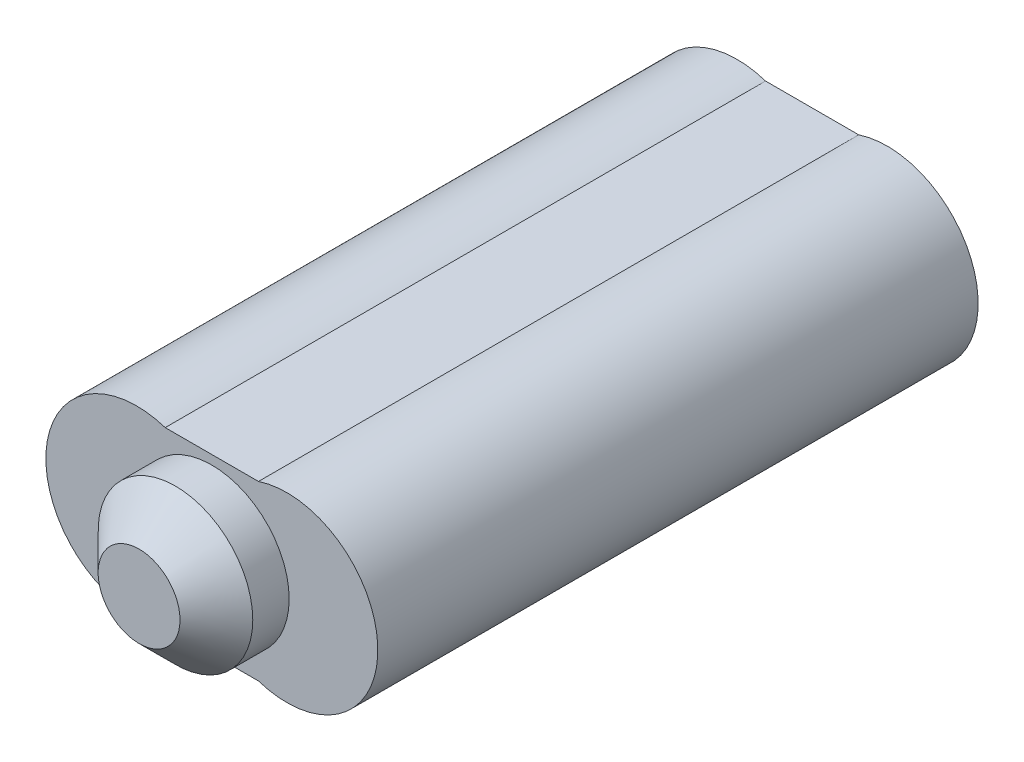
ISO-10303-21;
HEADER;
FILE_DESCRIPTION(('STEP AP214'),'2;1');
FILE_NAME('part.step','',(''),(''),'','','');
FILE_SCHEMA(('AUTOMOTIVE_DESIGN { 1 0 10303 214 1 1 1 1 }'));
ENDSEC;
DATA;
#1=APPLICATION_CONTEXT('core data for automotive mechanical design processes');
#2=APPLICATION_PROTOCOL_DEFINITION('international standard','automotive_design',2000,#1);
#3=PRODUCT_CONTEXT('',#1,'mechanical');
#4=PRODUCT('Part','Part','',(#3));
#5=PRODUCT_RELATED_PRODUCT_CATEGORY('part','',(#4));
#6=PRODUCT_DEFINITION_FORMATION('','',#4);
#7=PRODUCT_DEFINITION_CONTEXT('part definition',#1,'design');
#8=PRODUCT_DEFINITION('design','',#6,#7);
#9=PRODUCT_DEFINITION_SHAPE('','',#8);
#10=(LENGTH_UNIT() NAMED_UNIT(*) SI_UNIT(.MILLI.,.METRE.));
#11=(NAMED_UNIT(*) PLANE_ANGLE_UNIT() SI_UNIT($,.RADIAN.));
#12=(NAMED_UNIT(*) SI_UNIT($,.STERADIAN.) SOLID_ANGLE_UNIT());
#13=UNCERTAINTY_MEASURE_WITH_UNIT(LENGTH_MEASURE(1.E-05),#10,'distance_accuracy_value','');
#14=(GEOMETRIC_REPRESENTATION_CONTEXT(3) GLOBAL_UNCERTAINTY_ASSIGNED_CONTEXT((#13)) GLOBAL_UNIT_ASSIGNED_CONTEXT((#10,
#11,#12)) REPRESENTATION_CONTEXT('',''));
#15=CARTESIAN_POINT('',(0.,0.,0.));
#16=DIRECTION('',(0.,0.,1.));
#17=DIRECTION('',(1.,0.,0.));
#18=AXIS2_PLACEMENT_3D('',#15,#16,#17);
#19=CARTESIAN_POINT('',(0.,0.,66.));
#20=DIRECTION('',(0.,0.,-1.));
#21=DIRECTION('',(-1.,0.,0.));
#22=AXIS2_PLACEMENT_3D('',#19,#20,#21);
#23=CYLINDRICAL_SURFACE('',#22,10.);
#24=CARTESIAN_POINT('',(0.,0.,0.));
#25=DIRECTION('',(0.,0.,1.));
#26=DIRECTION('',(1.,0.,0.));
#27=AXIS2_PLACEMENT_3D('',#24,#25,#26);
#28=CIRCLE('',#27,10.);
#29=CARTESIAN_POINT('',(3.12249899919921,9.5,0.));
#30=VERTEX_POINT('',#29);
#31=CARTESIAN_POINT('',(3.12249899919921,-9.5,0.));
#32=VERTEX_POINT('',#31);
#33=EDGE_CURVE('E117',#30,#32,#28,.T.);
#34=ORIENTED_EDGE('',*,*,#33,.T.);
#35=DIRECTION('',(0.,0.,-1.));
#36=VECTOR('',#35,1.);
#37=CARTESIAN_POINT('',(3.12249899919921,-9.5,66.));
#38=LINE('',#37,#36);
#39=CARTESIAN_POINT('',(3.12249899919921,-9.5,66.));
#40=VERTEX_POINT('',#39);
#41=EDGE_CURVE('E106',#40,#32,#38,.T.);
#42=ORIENTED_EDGE('',*,*,#41,.F.);
#43=CARTESIAN_POINT('',(0.,0.,66.));
#44=DIRECTION('',(0.,0.,1.));
#45=DIRECTION('',(1.,0.,0.));
#46=AXIS2_PLACEMENT_3D('',#43,#44,#45);
#47=CIRCLE('',#46,10.);
#48=CARTESIAN_POINT('',(3.12249899919921,9.5,66.));
#49=VERTEX_POINT('',#48);
#50=EDGE_CURVE('E98',#49,#40,#47,.T.);
#51=ORIENTED_EDGE('',*,*,#50,.F.);
#52=DIRECTION('',(0.,0.,-1.));
#53=VECTOR('',#52,1.);
#54=CARTESIAN_POINT('',(3.12249899919921,9.5,66.));
#55=LINE('',#54,#53);
#56=EDGE_CURVE('E113',#49,#30,#55,.T.);
#57=ORIENTED_EDGE('',*,*,#56,.T.);
#58=EDGE_LOOP('',(#34,#42,#51,#57));
#59=FACE_BOUND('',#58,.T.);
#60=ADVANCED_FACE('F43',(#59),#23,.T.);
#61=CARTESIAN_POINT('',(3.12249899919921,-9.5,66.));
#62=DIRECTION('',(0.,1.,0.));
#63=DIRECTION('',(0.,0.,1.));
#64=AXIS2_PLACEMENT_3D('',#61,#62,#63);
#65=PLANE('',#64);
#66=DIRECTION('',(1.,0.,0.));
#67=VECTOR('',#66,1.);
#68=CARTESIAN_POINT('',(3.12249899919921,-9.5,0.));
#69=LINE('',#68,#67);
#70=CARTESIAN_POINT('',(13.3775010008008,-9.5,0.));
#71=VERTEX_POINT('',#70);
#72=EDGE_CURVE('E104',#32,#71,#69,.T.);
#73=ORIENTED_EDGE('',*,*,#72,.T.);
#74=DIRECTION('',(0.,0.,-1.));
#75=VECTOR('',#74,1.);
#76=CARTESIAN_POINT('',(13.3775010008008,-9.5,66.));
#77=LINE('',#76,#75);
#78=CARTESIAN_POINT('',(13.3775010008008,-9.5,66.));
#79=VERTEX_POINT('',#78);
#80=EDGE_CURVE('E102',#79,#71,#77,.T.);
#81=ORIENTED_EDGE('',*,*,#80,.F.);
#82=DIRECTION('',(1.,0.,0.));
#83=VECTOR('',#82,1.);
#84=CARTESIAN_POINT('',(3.12249899919921,-9.5,66.));
#85=LINE('',#84,#83);
#86=EDGE_CURVE('E93',#40,#79,#85,.T.);
#87=ORIENTED_EDGE('',*,*,#86,.F.);
#88=ORIENTED_EDGE('',*,*,#41,.T.);
#89=EDGE_LOOP('',(#73,#81,#87,#88));
#90=FACE_BOUND('',#89,.T.);
#91=ADVANCED_FACE('F103',(#90),#65,.F.);
#92=CARTESIAN_POINT('',(16.5,0.,66.));
#93=DIRECTION('',(0.,0.,-1.));
#94=DIRECTION('',(-1.,0.,0.));
#95=AXIS2_PLACEMENT_3D('',#92,#93,#94);
#96=CYLINDRICAL_SURFACE('',#95,10.);
#97=CARTESIAN_POINT('',(16.5,0.,0.));
#98=DIRECTION('',(0.,0.,1.));
#99=DIRECTION('',(1.,0.,0.));
#100=AXIS2_PLACEMENT_3D('',#97,#98,#99);
#101=CIRCLE('',#100,10.);
#102=CARTESIAN_POINT('',(13.3775010008008,9.5,0.));
#103=VERTEX_POINT('',#102);
#104=EDGE_CURVE('E79',#71,#103,#101,.T.);
#105=ORIENTED_EDGE('',*,*,#104,.T.);
#106=DIRECTION('',(0.,0.,-1.));
#107=VECTOR('',#106,1.);
#108=CARTESIAN_POINT('',(13.3775010008008,9.5,66.));
#109=LINE('',#108,#107);
#110=CARTESIAN_POINT('',(13.3775010008008,9.5,66.));
#111=VERTEX_POINT('',#110);
#112=EDGE_CURVE('E107',#111,#103,#109,.T.);
#113=ORIENTED_EDGE('',*,*,#112,.F.);
#114=CARTESIAN_POINT('',(16.5,0.,66.));
#115=DIRECTION('',(0.,0.,1.));
#116=DIRECTION('',(1.,0.,0.));
#117=AXIS2_PLACEMENT_3D('',#114,#115,#116);
#118=CIRCLE('',#117,10.);
#119=EDGE_CURVE('E96',#79,#111,#118,.T.);
#120=ORIENTED_EDGE('',*,*,#119,.F.);
#121=ORIENTED_EDGE('',*,*,#80,.T.);
#122=EDGE_LOOP('',(#105,#113,#120,#121));
#123=FACE_BOUND('',#122,.T.);
#124=ADVANCED_FACE('F109',(#123),#96,.T.);
#125=CARTESIAN_POINT('',(3.12249899919921,9.5,66.));
#126=DIRECTION('',(0.,-1.,0.));
#127=DIRECTION('',(0.,0.,-1.));
#128=AXIS2_PLACEMENT_3D('',#125,#126,#127);
#129=PLANE('',#128);
#130=DIRECTION('',(-1.,0.,0.));
#131=VECTOR('',#130,1.);
#132=CARTESIAN_POINT('',(3.12249899919921,9.5,0.));
#133=LINE('',#132,#131);
#134=EDGE_CURVE('E85',#103,#30,#133,.T.);
#135=ORIENTED_EDGE('',*,*,#134,.T.);
#136=ORIENTED_EDGE('',*,*,#56,.F.);
#137=DIRECTION('',(-1.,0.,0.));
#138=VECTOR('',#137,1.);
#139=CARTESIAN_POINT('',(3.12249899919921,9.5,66.));
#140=LINE('',#139,#138);
#141=EDGE_CURVE('E62',#111,#49,#140,.T.);
#142=ORIENTED_EDGE('',*,*,#141,.F.);
#143=ORIENTED_EDGE('',*,*,#112,.T.);
#144=EDGE_LOOP('',(#135,#136,#142,#143));
#145=FACE_BOUND('',#144,.T.);
#146=ADVANCED_FACE('F147',(#145),#129,.F.);
#147=CARTESIAN_POINT('',(0.,0.,66.));
#148=DIRECTION('',(0.,0.,1.));
#149=DIRECTION('',(1.,0.,0.));
#150=AXIS2_PLACEMENT_3D('',#147,#148,#149);
#151=PLANE('',#150);
#152=CARTESIAN_POINT('',(8.25,0.,66.));
#153=DIRECTION('',(0.,0.,1.));
#154=DIRECTION('',(1.,0.,0.));
#155=AXIS2_PLACEMENT_3D('',#152,#153,#154);
#156=CIRCLE('',#155,8.5);
#157=CARTESIAN_POINT('',(16.75,0.,66.));
#158=VERTEX_POINT('',#157);
#159=EDGE_CURVE('E132',#158,#158,#156,.T.);
#160=ORIENTED_EDGE('',*,*,#159,.F.);
#161=EDGE_LOOP('',(#160));
#162=FACE_BOUND('',#161,.T.);
#163=ORIENTED_EDGE('',*,*,#50,.T.);
#164=ORIENTED_EDGE('',*,*,#86,.T.);
#165=ORIENTED_EDGE('',*,*,#119,.T.);
#166=ORIENTED_EDGE('',*,*,#141,.T.);
#167=EDGE_LOOP('',(#163,#164,#165,#166));
#168=FACE_BOUND('',#167,.T.);
#169=ADVANCED_FACE('F94',(#162,#168),#151,.T.);
#170=CARTESIAN_POINT('',(0.,0.,0.));
#171=DIRECTION('',(0.,0.,1.));
#172=DIRECTION('',(1.,0.,0.));
#173=AXIS2_PLACEMENT_3D('',#170,#171,#172);
#174=PLANE('',#173);
#175=ORIENTED_EDGE('',*,*,#33,.F.);
#176=ORIENTED_EDGE('',*,*,#134,.F.);
#177=ORIENTED_EDGE('',*,*,#104,.F.);
#178=ORIENTED_EDGE('',*,*,#72,.F.);
#179=EDGE_LOOP('',(#175,#176,#177,#178));
#180=FACE_BOUND('',#179,.T.);
#181=ADVANCED_FACE('F146',(#180),#174,.F.);
#182=CARTESIAN_POINT('',(8.25,0.,74.));
#183=DIRECTION('',(0.,0.,-1.));
#184=DIRECTION('',(-1.,0.,0.));
#185=AXIS2_PLACEMENT_3D('',#182,#183,#184);
#186=CYLINDRICAL_SURFACE('',#185,8.5);
#187=CARTESIAN_POINT('',(8.25,0.,70.));
#188=DIRECTION('',(0.,0.,1.));
#189=DIRECTION('',(1.,0.,0.));
#190=AXIS2_PLACEMENT_3D('',#187,#188,#189);
#191=CIRCLE('',#190,8.5);
#192=CARTESIAN_POINT('',(16.75,0.,70.));
#193=VERTEX_POINT('',#192);
#194=EDGE_CURVE('E11',#193,#193,#191,.F.);
#195=ORIENTED_EDGE('',*,*,#194,.T.);
#196=EDGE_LOOP('',(#195));
#197=FACE_BOUND('',#196,.T.);
#198=ORIENTED_EDGE('',*,*,#159,.T.);
#199=EDGE_LOOP('',(#198));
#200=FACE_BOUND('',#199,.T.);
#201=ADVANCED_FACE('F143',(#197,#200),#186,.T.);
#202=CARTESIAN_POINT('',(8.25,0.,74.));
#203=DIRECTION('',(0.,0.,1.));
#204=DIRECTION('',(1.,0.,0.));
#205=AXIS2_PLACEMENT_3D('',#202,#203,#204);
#206=PLANE('',#205);
#207=CARTESIAN_POINT('',(8.25,0.,74.));
#208=DIRECTION('',(0.,0.,1.));
#209=DIRECTION('',(1.,0.,0.));
#210=AXIS2_PLACEMENT_3D('',#207,#208,#209);
#211=CIRCLE('',#210,4.5);
#212=CARTESIAN_POINT('',(12.75,0.,74.));
#213=VERTEX_POINT('',#212);
#214=EDGE_CURVE('E54',#213,#213,#211,.T.);
#215=ORIENTED_EDGE('',*,*,#214,.T.);
#216=EDGE_LOOP('',(#215));
#217=FACE_BOUND('',#216,.T.);
#218=ADVANCED_FACE('F192',(#217),#206,.T.);
#219=CARTESIAN_POINT('',(8.25,0.,74.));
#220=DIRECTION('',(0.,0.,-1.));
#221=DIRECTION('',(-1.,0.,0.));
#222=AXIS2_PLACEMENT_3D('',#219,#220,#221);
#223=CONICAL_SURFACE('',#222,4.5,0.785398163397447);
#224=ORIENTED_EDGE('',*,*,#194,.F.);
#225=EDGE_LOOP('',(#224));
#226=FACE_BOUND('',#225,.T.);
#227=ORIENTED_EDGE('',*,*,#214,.F.);
#228=EDGE_LOOP('',(#227));
#229=FACE_BOUND('',#228,.T.);
#230=ADVANCED_FACE('F46',(#226,#229),#223,.T.);
#231=CLOSED_SHELL('',(#60,#91,#124,#146,#169,#181,#201,#218,#230));
#232=MANIFOLD_SOLID_BREP('B2',#231);
#233=ADVANCED_BREP_SHAPE_REPRESENTATION('',(#18,#232),#14);
#234=SHAPE_DEFINITION_REPRESENTATION(#9,#233);
ENDSEC;
END-ISO-10303-21;
